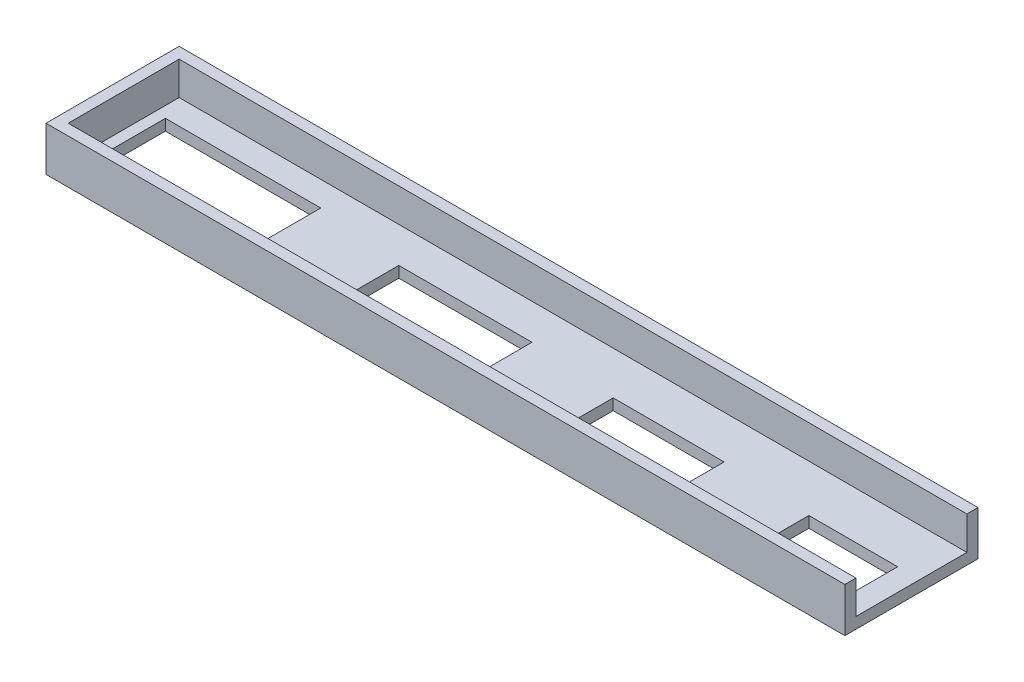
ISO-10303-21;
HEADER;
FILE_DESCRIPTION(('STEP AP214'),'2;1');
FILE_NAME('part.step','',(''),(''),'','','');
FILE_SCHEMA(('AUTOMOTIVE_DESIGN { 1 0 10303 214 1 1 1 1 }'));
ENDSEC;
DATA;
#1=APPLICATION_CONTEXT('core data for automotive mechanical design processes');
#2=APPLICATION_PROTOCOL_DEFINITION('international standard','automotive_design',2000,#1);
#3=PRODUCT_CONTEXT('',#1,'mechanical');
#4=PRODUCT('Part','Part','',(#3));
#5=PRODUCT_RELATED_PRODUCT_CATEGORY('part','',(#4));
#6=PRODUCT_DEFINITION_FORMATION('','',#4);
#7=PRODUCT_DEFINITION_CONTEXT('part definition',#1,'design');
#8=PRODUCT_DEFINITION('design','',#6,#7);
#9=PRODUCT_DEFINITION_SHAPE('','',#8);
#10=(LENGTH_UNIT() NAMED_UNIT(*) SI_UNIT(.MILLI.,.METRE.));
#11=(NAMED_UNIT(*) PLANE_ANGLE_UNIT() SI_UNIT($,.RADIAN.));
#12=(NAMED_UNIT(*) SI_UNIT($,.STERADIAN.) SOLID_ANGLE_UNIT());
#13=UNCERTAINTY_MEASURE_WITH_UNIT(LENGTH_MEASURE(1.E-05),#10,'distance_accuracy_value','');
#14=(GEOMETRIC_REPRESENTATION_CONTEXT(3) GLOBAL_UNCERTAINTY_ASSIGNED_CONTEXT((#13)) GLOBAL_UNIT_ASSIGNED_CONTEXT((#10,
#11,#12)) REPRESENTATION_CONTEXT('',''));
#15=CARTESIAN_POINT('',(0.,0.,0.));
#16=DIRECTION('',(0.,0.,1.));
#17=DIRECTION('',(1.,0.,0.));
#18=AXIS2_PLACEMENT_3D('',#15,#16,#17);
#19=CARTESIAN_POINT('',(0.,0.,0.));
#20=DIRECTION('',(0.,-1.,0.));
#21=DIRECTION('',(0.,0.,-1.));
#22=AXIS2_PLACEMENT_3D('',#19,#20,#21);
#23=PLANE('',#22);
#24=DIRECTION('',(0.,0.,-1.));
#25=VECTOR('',#24,1.);
#26=CARTESIAN_POINT('',(228.6,0.,0.));
#27=LINE('',#26,#25);
#28=CARTESIAN_POINT('',(228.6,0.,0.));
#29=VERTEX_POINT('',#28);
#30=CARTESIAN_POINT('',(228.6,0.,-3.175));
#31=VERTEX_POINT('',#30);
#32=EDGE_CURVE('E454',#29,#31,#27,.T.);
#33=ORIENTED_EDGE('',*,*,#32,.T.);
#34=DIRECTION('',(1.,0.,0.));
#35=VECTOR('',#34,1.);
#36=CARTESIAN_POINT('',(0.,0.,-3.175));
#37=LINE('',#36,#35);
#38=CARTESIAN_POINT('',(3.175,0.,-3.175));
#39=VERTEX_POINT('',#38);
#40=EDGE_CURVE('E423',#39,#31,#37,.T.);
#41=ORIENTED_EDGE('',*,*,#40,.F.);
#42=DIRECTION('',(0.,0.,1.));
#43=VECTOR('',#42,1.);
#44=CARTESIAN_POINT('',(3.175,0.,0.));
#45=LINE('',#44,#43);
#46=CARTESIAN_POINT('',(3.175,0.,-34.925));
#47=VERTEX_POINT('',#46);
#48=EDGE_CURVE('E397',#47,#39,#45,.T.);
#49=ORIENTED_EDGE('',*,*,#48,.F.);
#50=DIRECTION('',(-1.,0.,0.));
#51=VECTOR('',#50,1.);
#52=CARTESIAN_POINT('',(0.,0.,-34.925));
#53=LINE('',#52,#51);
#54=CARTESIAN_POINT('',(228.6,0.,-34.925));
#55=VERTEX_POINT('',#54);
#56=EDGE_CURVE('E411',#55,#47,#53,.T.);
#57=ORIENTED_EDGE('',*,*,#56,.F.);
#58=CARTESIAN_POINT('',(228.6,0.,-38.1));
#59=VERTEX_POINT('',#58);
#60=EDGE_CURVE('E453',#55,#59,#27,.T.);
#61=ORIENTED_EDGE('',*,*,#60,.T.);
#62=DIRECTION('',(-1.,0.,0.));
#63=VECTOR('',#62,1.);
#64=CARTESIAN_POINT('',(0.,0.,-38.1));
#65=LINE('',#64,#63);
#66=CARTESIAN_POINT('',(0.,0.,-38.1));
#67=VERTEX_POINT('',#66);
#68=EDGE_CURVE('E434',#59,#67,#65,.T.);
#69=ORIENTED_EDGE('',*,*,#68,.T.);
#70=DIRECTION('',(0.,0.,1.));
#71=VECTOR('',#70,1.);
#72=CARTESIAN_POINT('',(0.,0.,0.));
#73=LINE('',#72,#71);
#74=CARTESIAN_POINT('',(0.,0.,0.));
#75=VERTEX_POINT('',#74);
#76=EDGE_CURVE('E404',#67,#75,#73,.T.);
#77=ORIENTED_EDGE('',*,*,#76,.T.);
#78=DIRECTION('',(1.,0.,0.));
#79=VECTOR('',#78,1.);
#80=CARTESIAN_POINT('',(0.,0.,0.));
#81=LINE('',#80,#79);
#82=EDGE_CURVE('E449',#75,#29,#81,.T.);
#83=ORIENTED_EDGE('',*,*,#82,.T.);
#84=EDGE_LOOP('',(#33,#41,#49,#57,#61,#69,#77,#83));
#85=FACE_BOUND('',#84,.T.);
#86=ADVANCED_FACE('F43',(#85),#23,.F.);
#87=CARTESIAN_POINT('',(0.,-12.7,0.));
#88=DIRECTION('',(-1.,0.,0.));
#89=DIRECTION('',(0.,0.,1.));
#90=AXIS2_PLACEMENT_3D('',#87,#88,#89);
#91=PLANE('',#90);
#92=ORIENTED_EDGE('',*,*,#76,.F.);
#93=DIRECTION('',(0.,1.,0.));
#94=VECTOR('',#93,1.);
#95=CARTESIAN_POINT('',(0.,-12.7,-38.1));
#96=LINE('',#95,#94);
#97=CARTESIAN_POINT('',(0.,-12.7,-38.1));
#98=VERTEX_POINT('',#97);
#99=EDGE_CURVE('E11',#98,#67,#96,.T.);
#100=ORIENTED_EDGE('',*,*,#99,.F.);
#101=DIRECTION('',(0.,0.,1.));
#102=VECTOR('',#101,1.);
#103=CARTESIAN_POINT('',(0.,-12.7,0.));
#104=LINE('',#103,#102);
#105=CARTESIAN_POINT('',(0.,-12.7,0.));
#106=VERTEX_POINT('',#105);
#107=EDGE_CURVE('E429',#98,#106,#104,.T.);
#108=ORIENTED_EDGE('',*,*,#107,.T.);
#109=DIRECTION('',(0.,1.,0.));
#110=VECTOR('',#109,1.);
#111=CARTESIAN_POINT('',(0.,-12.7,0.));
#112=LINE('',#111,#110);
#113=EDGE_CURVE('E47',#106,#75,#112,.T.);
#114=ORIENTED_EDGE('',*,*,#113,.T.);
#115=EDGE_LOOP('',(#92,#100,#108,#114));
#116=FACE_BOUND('',#115,.T.);
#117=ADVANCED_FACE('F45',(#116),#91,.T.);
#118=CARTESIAN_POINT('',(0.,-12.7,-38.1));
#119=DIRECTION('',(0.,0.,-1.));
#120=DIRECTION('',(-1.,0.,0.));
#121=AXIS2_PLACEMENT_3D('',#118,#119,#120);
#122=PLANE('',#121);
#123=ORIENTED_EDGE('',*,*,#68,.F.);
#124=DIRECTION('',(0.,1.,0.));
#125=VECTOR('',#124,1.);
#126=CARTESIAN_POINT('',(228.6,-12.7,-38.1));
#127=LINE('',#126,#125);
#128=CARTESIAN_POINT('',(228.6,-12.7,-38.1));
#129=VERTEX_POINT('',#128);
#130=EDGE_CURVE('E53',#129,#59,#127,.T.);
#131=ORIENTED_EDGE('',*,*,#130,.F.);
#132=DIRECTION('',(-1.,0.,0.));
#133=VECTOR('',#132,1.);
#134=CARTESIAN_POINT('',(0.,-12.7,-38.1));
#135=LINE('',#134,#133);
#136=EDGE_CURVE('E442',#129,#98,#135,.T.);
#137=ORIENTED_EDGE('',*,*,#136,.T.);
#138=ORIENTED_EDGE('',*,*,#99,.T.);
#139=EDGE_LOOP('',(#123,#131,#137,#138));
#140=FACE_BOUND('',#139,.T.);
#141=ADVANCED_FACE('F478',(#140),#122,.T.);
#142=CARTESIAN_POINT('',(228.6,-12.7,0.));
#143=DIRECTION('',(1.,0.,0.));
#144=DIRECTION('',(0.,0.,-1.));
#145=AXIS2_PLACEMENT_3D('',#142,#143,#144);
#146=PLANE('',#145);
#147=DIRECTION('',(0.,1.,0.));
#148=VECTOR('',#147,1.);
#149=CARTESIAN_POINT('',(228.6,-41.4333550970588,-3.175));
#150=LINE('',#149,#148);
#151=CARTESIAN_POINT('',(228.6,-9.525,-3.175));
#152=VERTEX_POINT('',#151);
#153=EDGE_CURVE('E254',#152,#31,#150,.T.);
#154=ORIENTED_EDGE('',*,*,#153,.T.);
#155=ORIENTED_EDGE('',*,*,#32,.F.);
#156=DIRECTION('',(0.,1.,0.));
#157=VECTOR('',#156,1.);
#158=CARTESIAN_POINT('',(228.6,-12.7,0.));
#159=LINE('',#158,#157);
#160=CARTESIAN_POINT('',(228.6,-12.7,0.));
#161=VERTEX_POINT('',#160);
#162=EDGE_CURVE('E463',#161,#29,#159,.T.);
#163=ORIENTED_EDGE('',*,*,#162,.F.);
#164=DIRECTION('',(0.,0.,-1.));
#165=VECTOR('',#164,1.);
#166=CARTESIAN_POINT('',(228.6,-12.7,0.));
#167=LINE('',#166,#165);
#168=EDGE_CURVE('E438',#161,#129,#167,.T.);
#169=ORIENTED_EDGE('',*,*,#168,.T.);
#170=ORIENTED_EDGE('',*,*,#130,.T.);
#171=ORIENTED_EDGE('',*,*,#60,.F.);
#172=DIRECTION('',(0.,1.,0.));
#173=VECTOR('',#172,1.);
#174=CARTESIAN_POINT('',(228.6,-41.4333550970588,-34.925));
#175=LINE('',#174,#173);
#176=CARTESIAN_POINT('',(228.6,-9.525,-34.925));
#177=VERTEX_POINT('',#176);
#178=EDGE_CURVE('E393',#177,#55,#175,.T.);
#179=ORIENTED_EDGE('',*,*,#178,.F.);
#180=DIRECTION('',(0.,0.,-1.));
#181=VECTOR('',#180,1.);
#182=CARTESIAN_POINT('',(228.6,-9.525,-34.925));
#183=LINE('',#182,#181);
#184=EDGE_CURVE('E389',#152,#177,#183,.T.);
#185=ORIENTED_EDGE('',*,*,#184,.F.);
#186=EDGE_LOOP('',(#154,#155,#163,#169,#170,#171,#179,#185));
#187=FACE_BOUND('',#186,.T.);
#188=ADVANCED_FACE('F483',(#187),#146,.T.);
#189=CARTESIAN_POINT('',(0.,-12.7,0.));
#190=DIRECTION('',(0.,0.,1.));
#191=DIRECTION('',(1.,0.,0.));
#192=AXIS2_PLACEMENT_3D('',#189,#190,#191);
#193=PLANE('',#192);
#194=ORIENTED_EDGE('',*,*,#82,.F.);
#195=ORIENTED_EDGE('',*,*,#113,.F.);
#196=DIRECTION('',(1.,0.,0.));
#197=VECTOR('',#196,1.);
#198=CARTESIAN_POINT('',(0.,-12.7,0.));
#199=LINE('',#198,#197);
#200=EDGE_CURVE('E433',#106,#161,#199,.T.);
#201=ORIENTED_EDGE('',*,*,#200,.T.);
#202=ORIENTED_EDGE('',*,*,#162,.T.);
#203=EDGE_LOOP('',(#194,#195,#201,#202));
#204=FACE_BOUND('',#203,.T.);
#205=ADVANCED_FACE('F473',(#204),#193,.T.);
#206=CARTESIAN_POINT('',(0.,-12.7,0.));
#207=DIRECTION('',(0.,-1.,0.));
#208=DIRECTION('',(0.,0.,-1.));
#209=AXIS2_PLACEMENT_3D('',#206,#207,#208);
#210=PLANE('',#209);
#211=DIRECTION('',(0.,0.,-1.));
#212=VECTOR('',#211,1.);
#213=CARTESIAN_POINT('',(222.25,-12.7,-5.08));
#214=LINE('',#213,#212);
#215=CARTESIAN_POINT('',(222.25,-12.7,-5.08));
#216=VERTEX_POINT('',#215);
#217=CARTESIAN_POINT('',(222.25,-12.7,-21.463));
#218=VERTEX_POINT('',#217);
#219=EDGE_CURVE('E210',#216,#218,#214,.T.);
#220=ORIENTED_EDGE('',*,*,#219,.T.);
#221=DIRECTION('',(-1.,0.,0.));
#222=VECTOR('',#221,1.);
#223=CARTESIAN_POINT('',(222.25,-12.7,-21.463));
#224=LINE('',#223,#222);
#225=CARTESIAN_POINT('',(196.85,-12.7,-21.463));
#226=VERTEX_POINT('',#225);
#227=EDGE_CURVE('E222',#218,#226,#224,.T.);
#228=ORIENTED_EDGE('',*,*,#227,.T.);
#229=DIRECTION('',(0.,0.,1.));
#230=VECTOR('',#229,1.);
#231=CARTESIAN_POINT('',(196.85,-12.7,-5.08));
#232=LINE('',#231,#230);
#233=CARTESIAN_POINT('',(196.85,-12.7,-5.08));
#234=VERTEX_POINT('',#233);
#235=EDGE_CURVE('E61',#226,#234,#232,.T.);
#236=ORIENTED_EDGE('',*,*,#235,.T.);
#237=DIRECTION('',(1.,0.,0.));
#238=VECTOR('',#237,1.);
#239=CARTESIAN_POINT('',(222.25,-12.7,-5.08));
#240=LINE('',#239,#238);
#241=EDGE_CURVE('E219',#234,#216,#240,.T.);
#242=ORIENTED_EDGE('',*,*,#241,.T.);
#243=EDGE_LOOP('',(#220,#228,#236,#242));
#244=FACE_BOUND('',#243,.T.);
#245=DIRECTION('',(0.,0.,1.));
#246=VECTOR('',#245,1.);
#247=CARTESIAN_POINT('',(139.7,-12.7,-22.606));
#248=LINE('',#247,#246);
#249=CARTESIAN_POINT('',(139.7,-12.7,-22.606));
#250=VERTEX_POINT('',#249);
#251=CARTESIAN_POINT('',(139.7,-12.7,-5.08));
#252=VERTEX_POINT('',#251);
#253=EDGE_CURVE('E280',#250,#252,#248,.T.);
#254=ORIENTED_EDGE('',*,*,#253,.T.);
#255=DIRECTION('',(1.,0.,0.));
#256=VECTOR('',#255,1.);
#257=CARTESIAN_POINT('',(139.7,-12.7,-5.08));
#258=LINE('',#257,#256);
#259=CARTESIAN_POINT('',(171.45,-12.7,-5.08));
#260=VERTEX_POINT('',#259);
#261=EDGE_CURVE('E295',#252,#260,#258,.T.);
#262=ORIENTED_EDGE('',*,*,#261,.T.);
#263=DIRECTION('',(0.,0.,-1.));
#264=VECTOR('',#263,1.);
#265=CARTESIAN_POINT('',(171.45,-12.7,-22.606));
#266=LINE('',#265,#264);
#267=CARTESIAN_POINT('',(171.45,-12.7,-22.606));
#268=VERTEX_POINT('',#267);
#269=EDGE_CURVE('E69',#260,#268,#266,.T.);
#270=ORIENTED_EDGE('',*,*,#269,.T.);
#271=DIRECTION('',(-1.,0.,0.));
#272=VECTOR('',#271,1.);
#273=CARTESIAN_POINT('',(139.7,-12.7,-22.606));
#274=LINE('',#273,#272);
#275=EDGE_CURVE('E264',#268,#250,#274,.T.);
#276=ORIENTED_EDGE('',*,*,#275,.T.);
#277=EDGE_LOOP('',(#254,#262,#270,#276));
#278=FACE_BOUND('',#277,.T.);
#279=DIRECTION('',(0.,0.,1.));
#280=VECTOR('',#279,1.);
#281=CARTESIAN_POINT('',(76.2,-12.7,-24.765));
#282=LINE('',#281,#280);
#283=CARTESIAN_POINT('',(76.2,-12.7,-24.765));
#284=VERTEX_POINT('',#283);
#285=CARTESIAN_POINT('',(76.2,-12.7,-5.08));
#286=VERTEX_POINT('',#285);
#287=EDGE_CURVE('E322',#284,#286,#282,.T.);
#288=ORIENTED_EDGE('',*,*,#287,.T.);
#289=DIRECTION('',(1.,0.,0.));
#290=VECTOR('',#289,1.);
#291=CARTESIAN_POINT('',(76.2,-12.7,-5.08));
#292=LINE('',#291,#290);
#293=CARTESIAN_POINT('',(114.3,-12.7,-5.08));
#294=VERTEX_POINT('',#293);
#295=EDGE_CURVE('E339',#286,#294,#292,.T.);
#296=ORIENTED_EDGE('',*,*,#295,.T.);
#297=DIRECTION('',(0.,0.,-1.));
#298=VECTOR('',#297,1.);
#299=CARTESIAN_POINT('',(114.3,-12.7,-24.765));
#300=LINE('',#299,#298);
#301=CARTESIAN_POINT('',(114.3,-12.7,-24.765));
#302=VERTEX_POINT('',#301);
#303=EDGE_CURVE('E335',#294,#302,#300,.T.);
#304=ORIENTED_EDGE('',*,*,#303,.T.);
#305=DIRECTION('',(-1.,0.,0.));
#306=VECTOR('',#305,1.);
#307=CARTESIAN_POINT('',(76.2,-12.7,-24.765));
#308=LINE('',#307,#306);
#309=EDGE_CURVE('E306',#302,#284,#308,.T.);
#310=ORIENTED_EDGE('',*,*,#309,.T.);
#311=EDGE_LOOP('',(#288,#296,#304,#310));
#312=FACE_BOUND('',#311,.T.);
#313=DIRECTION('',(0.,0.,1.));
#314=VECTOR('',#313,1.);
#315=CARTESIAN_POINT('',(6.34999999999999,-12.7,-27.813));
#316=LINE('',#315,#314);
#317=CARTESIAN_POINT('',(6.34999999999999,-12.7,-27.813));
#318=VERTEX_POINT('',#317);
#319=CARTESIAN_POINT('',(6.34999999999999,-12.7,-5.08));
#320=VERTEX_POINT('',#319);
#321=EDGE_CURVE('E365',#318,#320,#316,.T.);
#322=ORIENTED_EDGE('',*,*,#321,.T.);
#323=DIRECTION('',(1.,0.,0.));
#324=VECTOR('',#323,1.);
#325=CARTESIAN_POINT('',(6.34999999999999,-12.7,-5.08));
#326=LINE('',#325,#324);
#327=CARTESIAN_POINT('',(50.8,-12.7,-5.08));
#328=VERTEX_POINT('',#327);
#329=EDGE_CURVE('E382',#320,#328,#326,.T.);
#330=ORIENTED_EDGE('',*,*,#329,.T.);
#331=DIRECTION('',(0.,0.,-1.));
#332=VECTOR('',#331,1.);
#333=CARTESIAN_POINT('',(50.8,-12.7,-27.813));
#334=LINE('',#333,#332);
#335=CARTESIAN_POINT('',(50.8,-12.7,-27.813));
#336=VERTEX_POINT('',#335);
#337=EDGE_CURVE('E378',#328,#336,#334,.T.);
#338=ORIENTED_EDGE('',*,*,#337,.T.);
#339=DIRECTION('',(-1.,0.,0.));
#340=VECTOR('',#339,1.);
#341=CARTESIAN_POINT('',(6.34999999999999,-12.7,-27.813));
#342=LINE('',#341,#340);
#343=EDGE_CURVE('E350',#336,#318,#342,.T.);
#344=ORIENTED_EDGE('',*,*,#343,.T.);
#345=EDGE_LOOP('',(#322,#330,#338,#344));
#346=FACE_BOUND('',#345,.T.);
#347=ORIENTED_EDGE('',*,*,#107,.F.);
#348=ORIENTED_EDGE('',*,*,#136,.F.);
#349=ORIENTED_EDGE('',*,*,#168,.F.);
#350=ORIENTED_EDGE('',*,*,#200,.F.);
#351=EDGE_LOOP('',(#347,#348,#349,#350));
#352=FACE_BOUND('',#351,.T.);
#353=ADVANCED_FACE('F227',(#244,#278,#312,#346,#352),#210,.T.);
#354=CARTESIAN_POINT('',(3.175,-12.7,0.));
#355=DIRECTION('',(-1.,0.,0.));
#356=DIRECTION('',(0.,0.,1.));
#357=AXIS2_PLACEMENT_3D('',#354,#355,#356);
#358=PLANE('',#357);
#359=ORIENTED_EDGE('',*,*,#48,.T.);
#360=DIRECTION('',(0.,1.,0.));
#361=VECTOR('',#360,1.);
#362=CARTESIAN_POINT('',(3.175,-12.7,-3.175));
#363=LINE('',#362,#361);
#364=CARTESIAN_POINT('',(3.175,-9.525,-3.175));
#365=VERTEX_POINT('',#364);
#366=EDGE_CURVE('E405',#365,#39,#363,.T.);
#367=ORIENTED_EDGE('',*,*,#366,.F.);
#368=DIRECTION('',(0.,0.,1.));
#369=VECTOR('',#368,1.);
#370=CARTESIAN_POINT('',(3.175,-9.525,0.));
#371=LINE('',#370,#369);
#372=CARTESIAN_POINT('',(3.175,-9.525,-34.925));
#373=VERTEX_POINT('',#372);
#374=EDGE_CURVE('E406',#373,#365,#371,.T.);
#375=ORIENTED_EDGE('',*,*,#374,.F.);
#376=DIRECTION('',(0.,1.,0.));
#377=VECTOR('',#376,1.);
#378=CARTESIAN_POINT('',(3.175,-12.7,-34.925));
#379=LINE('',#378,#377);
#380=EDGE_CURVE('E401',#373,#47,#379,.T.);
#381=ORIENTED_EDGE('',*,*,#380,.T.);
#382=EDGE_LOOP('',(#359,#367,#375,#381));
#383=FACE_BOUND('',#382,.T.);
#384=ADVANCED_FACE('F493',(#383),#358,.F.);
#385=CARTESIAN_POINT('',(0.,-12.7,-34.925));
#386=DIRECTION('',(0.,0.,-1.));
#387=DIRECTION('',(-1.,0.,0.));
#388=AXIS2_PLACEMENT_3D('',#385,#386,#387);
#389=PLANE('',#388);
#390=ORIENTED_EDGE('',*,*,#56,.T.);
#391=ORIENTED_EDGE('',*,*,#380,.F.);
#392=DIRECTION('',(-1.,0.,0.));
#393=VECTOR('',#392,1.);
#394=CARTESIAN_POINT('',(0.,-9.525,-34.925));
#395=LINE('',#394,#393);
#396=EDGE_CURVE('E414',#177,#373,#395,.T.);
#397=ORIENTED_EDGE('',*,*,#396,.F.);
#398=ORIENTED_EDGE('',*,*,#178,.T.);
#399=EDGE_LOOP('',(#390,#391,#397,#398));
#400=FACE_BOUND('',#399,.T.);
#401=ADVANCED_FACE('F495',(#400),#389,.F.);
#402=CARTESIAN_POINT('',(0.,-12.7,-3.175));
#403=DIRECTION('',(0.,0.,1.));
#404=DIRECTION('',(1.,0.,0.));
#405=AXIS2_PLACEMENT_3D('',#402,#403,#404);
#406=PLANE('',#405);
#407=ORIENTED_EDGE('',*,*,#40,.T.);
#408=ORIENTED_EDGE('',*,*,#153,.F.);
#409=DIRECTION('',(1.,0.,0.));
#410=VECTOR('',#409,1.);
#411=CARTESIAN_POINT('',(0.,-9.525,-3.175));
#412=LINE('',#411,#410);
#413=EDGE_CURVE('E410',#365,#152,#412,.T.);
#414=ORIENTED_EDGE('',*,*,#413,.F.);
#415=ORIENTED_EDGE('',*,*,#366,.T.);
#416=EDGE_LOOP('',(#407,#408,#414,#415));
#417=FACE_BOUND('',#416,.T.);
#418=ADVANCED_FACE('F489',(#417),#406,.F.);
#419=CARTESIAN_POINT('',(0.,-9.525,0.));
#420=DIRECTION('',(0.,-1.,0.));
#421=DIRECTION('',(0.,0.,-1.));
#422=AXIS2_PLACEMENT_3D('',#419,#420,#421);
#423=PLANE('',#422);
#424=DIRECTION('',(-1.,0.,0.));
#425=VECTOR('',#424,1.);
#426=CARTESIAN_POINT('',(222.25,-9.525,-21.463));
#427=LINE('',#426,#425);
#428=CARTESIAN_POINT('',(222.25,-9.525,-21.463));
#429=VERTEX_POINT('',#428);
#430=CARTESIAN_POINT('',(196.85,-9.525,-21.463));
#431=VERTEX_POINT('',#430);
#432=EDGE_CURVE('E244',#429,#431,#427,.T.);
#433=ORIENTED_EDGE('',*,*,#432,.F.);
#434=DIRECTION('',(0.,0.,-1.));
#435=VECTOR('',#434,1.);
#436=CARTESIAN_POINT('',(222.25,-9.525,-5.08));
#437=LINE('',#436,#435);
#438=CARTESIAN_POINT('',(222.25,-9.525,-5.08));
#439=VERTEX_POINT('',#438);
#440=EDGE_CURVE('E213',#439,#429,#437,.T.);
#441=ORIENTED_EDGE('',*,*,#440,.F.);
#442=DIRECTION('',(1.,0.,0.));
#443=VECTOR('',#442,1.);
#444=CARTESIAN_POINT('',(222.25,-9.525,-5.08));
#445=LINE('',#444,#443);
#446=CARTESIAN_POINT('',(196.85,-9.525,-5.08));
#447=VERTEX_POINT('',#446);
#448=EDGE_CURVE('E231',#447,#439,#445,.T.);
#449=ORIENTED_EDGE('',*,*,#448,.F.);
#450=DIRECTION('',(0.,0.,1.));
#451=VECTOR('',#450,1.);
#452=CARTESIAN_POINT('',(196.85,-9.525,-5.08));
#453=LINE('',#452,#451);
#454=EDGE_CURVE('E235',#431,#447,#453,.T.);
#455=ORIENTED_EDGE('',*,*,#454,.F.);
#456=EDGE_LOOP('',(#433,#441,#449,#455));
#457=FACE_BOUND('',#456,.T.);
#458=DIRECTION('',(1.,0.,0.));
#459=VECTOR('',#458,1.);
#460=CARTESIAN_POINT('',(139.7,-9.525,-5.08));
#461=LINE('',#460,#459);
#462=CARTESIAN_POINT('',(139.7,-9.525,-5.08));
#463=VERTEX_POINT('',#462);
#464=CARTESIAN_POINT('',(171.45,-9.525,-5.08));
#465=VERTEX_POINT('',#464);
#466=EDGE_CURVE('E284',#463,#465,#461,.T.);
#467=ORIENTED_EDGE('',*,*,#466,.F.);
#468=DIRECTION('',(0.,0.,1.));
#469=VECTOR('',#468,1.);
#470=CARTESIAN_POINT('',(139.7,-9.525,-22.606));
#471=LINE('',#470,#469);
#472=CARTESIAN_POINT('',(139.7,-9.525,-22.606));
#473=VERTEX_POINT('',#472);
#474=EDGE_CURVE('E245',#473,#463,#471,.T.);
#475=ORIENTED_EDGE('',*,*,#474,.F.);
#476=DIRECTION('',(-1.,0.,0.));
#477=VECTOR('',#476,1.);
#478=CARTESIAN_POINT('',(139.7,-9.525,-22.606));
#479=LINE('',#478,#477);
#480=CARTESIAN_POINT('',(171.45,-9.525,-22.606));
#481=VERTEX_POINT('',#480);
#482=EDGE_CURVE('E275',#481,#473,#479,.T.);
#483=ORIENTED_EDGE('',*,*,#482,.F.);
#484=DIRECTION('',(0.,0.,-1.));
#485=VECTOR('',#484,1.);
#486=CARTESIAN_POINT('',(171.45,-9.525,-22.606));
#487=LINE('',#486,#485);
#488=EDGE_CURVE('E279',#465,#481,#487,.T.);
#489=ORIENTED_EDGE('',*,*,#488,.F.);
#490=EDGE_LOOP('',(#467,#475,#483,#489));
#491=FACE_BOUND('',#490,.T.);
#492=DIRECTION('',(1.,0.,0.));
#493=VECTOR('',#492,1.);
#494=CARTESIAN_POINT('',(76.2,-9.525,-5.08));
#495=LINE('',#494,#493);
#496=CARTESIAN_POINT('',(76.2,-9.525,-5.08));
#497=VERTEX_POINT('',#496);
#498=CARTESIAN_POINT('',(114.3,-9.525,-5.08));
#499=VERTEX_POINT('',#498);
#500=EDGE_CURVE('E326',#497,#499,#495,.T.);
#501=ORIENTED_EDGE('',*,*,#500,.F.);
#502=DIRECTION('',(0.,0.,1.));
#503=VECTOR('',#502,1.);
#504=CARTESIAN_POINT('',(76.2,-9.525,-24.765));
#505=LINE('',#504,#503);
#506=CARTESIAN_POINT('',(76.2,-9.525,-24.765));
#507=VERTEX_POINT('',#506);
#508=EDGE_CURVE('E274',#507,#497,#505,.T.);
#509=ORIENTED_EDGE('',*,*,#508,.F.);
#510=DIRECTION('',(-1.,0.,0.));
#511=VECTOR('',#510,1.);
#512=CARTESIAN_POINT('',(76.2,-9.525,-24.765));
#513=LINE('',#512,#511);
#514=CARTESIAN_POINT('',(114.3,-9.525,-24.765));
#515=VERTEX_POINT('',#514);
#516=EDGE_CURVE('E317',#515,#507,#513,.T.);
#517=ORIENTED_EDGE('',*,*,#516,.F.);
#518=DIRECTION('',(0.,0.,-1.));
#519=VECTOR('',#518,1.);
#520=CARTESIAN_POINT('',(114.3,-9.525,-24.765));
#521=LINE('',#520,#519);
#522=EDGE_CURVE('E321',#499,#515,#521,.T.);
#523=ORIENTED_EDGE('',*,*,#522,.F.);
#524=EDGE_LOOP('',(#501,#509,#517,#523));
#525=FACE_BOUND('',#524,.T.);
#526=DIRECTION('',(1.,0.,0.));
#527=VECTOR('',#526,1.);
#528=CARTESIAN_POINT('',(6.34999999999999,-9.525,-5.08));
#529=LINE('',#528,#527);
#530=CARTESIAN_POINT('',(6.34999999999999,-9.525,-5.08));
#531=VERTEX_POINT('',#530);
#532=CARTESIAN_POINT('',(50.8,-9.525,-5.08));
#533=VERTEX_POINT('',#532);
#534=EDGE_CURVE('E369',#531,#533,#529,.T.);
#535=ORIENTED_EDGE('',*,*,#534,.F.);
#536=DIRECTION('',(0.,0.,1.));
#537=VECTOR('',#536,1.);
#538=CARTESIAN_POINT('',(6.34999999999999,-9.525,-27.813));
#539=LINE('',#538,#537);
#540=CARTESIAN_POINT('',(6.34999999999999,-9.525,-27.813));
#541=VERTEX_POINT('',#540);
#542=EDGE_CURVE('E316',#541,#531,#539,.T.);
#543=ORIENTED_EDGE('',*,*,#542,.F.);
#544=DIRECTION('',(-1.,0.,0.));
#545=VECTOR('',#544,1.);
#546=CARTESIAN_POINT('',(6.34999999999999,-9.525,-27.813));
#547=LINE('',#546,#545);
#548=CARTESIAN_POINT('',(50.8,-9.525,-27.813));
#549=VERTEX_POINT('',#548);
#550=EDGE_CURVE('E360',#549,#541,#547,.T.);
#551=ORIENTED_EDGE('',*,*,#550,.F.);
#552=DIRECTION('',(0.,0.,-1.));
#553=VECTOR('',#552,1.);
#554=CARTESIAN_POINT('',(50.8,-9.525,-27.813));
#555=LINE('',#554,#553);
#556=EDGE_CURVE('E364',#533,#549,#555,.T.);
#557=ORIENTED_EDGE('',*,*,#556,.F.);
#558=EDGE_LOOP('',(#535,#543,#551,#557));
#559=FACE_BOUND('',#558,.T.);
#560=ORIENTED_EDGE('',*,*,#374,.T.);
#561=ORIENTED_EDGE('',*,*,#413,.T.);
#562=ORIENTED_EDGE('',*,*,#184,.T.);
#563=ORIENTED_EDGE('',*,*,#396,.T.);
#564=EDGE_LOOP('',(#560,#561,#562,#563));
#565=FACE_BOUND('',#564,.T.);
#566=ADVANCED_FACE('F499',(#457,#491,#525,#559,#565),#423,.F.);
#567=CARTESIAN_POINT('',(6.34999999999999,-12.7,-27.813));
#568=DIRECTION('',(-1.,0.,0.));
#569=DIRECTION('',(0.,0.,1.));
#570=AXIS2_PLACEMENT_3D('',#567,#568,#569);
#571=PLANE('',#570);
#572=ORIENTED_EDGE('',*,*,#542,.T.);
#573=DIRECTION('',(0.,1.,0.));
#574=VECTOR('',#573,1.);
#575=CARTESIAN_POINT('',(6.34999999999999,-12.7,-5.08));
#576=LINE('',#575,#574);
#577=EDGE_CURVE('E346',#320,#531,#576,.T.);
#578=ORIENTED_EDGE('',*,*,#577,.F.);
#579=ORIENTED_EDGE('',*,*,#321,.F.);
#580=DIRECTION('',(0.,1.,0.));
#581=VECTOR('',#580,1.);
#582=CARTESIAN_POINT('',(6.34999999999999,-12.7,-27.813));
#583=LINE('',#582,#581);
#584=EDGE_CURVE('E357',#318,#541,#583,.T.);
#585=ORIENTED_EDGE('',*,*,#584,.T.);
#586=EDGE_LOOP('',(#572,#578,#579,#585));
#587=FACE_BOUND('',#586,.T.);
#588=ADVANCED_FACE('F501',(#587),#571,.F.);
#589=CARTESIAN_POINT('',(6.34999999999999,-12.7,-27.813));
#590=DIRECTION('',(0.,0.,-1.));
#591=DIRECTION('',(-1.,0.,0.));
#592=AXIS2_PLACEMENT_3D('',#589,#590,#591);
#593=PLANE('',#592);
#594=ORIENTED_EDGE('',*,*,#550,.T.);
#595=ORIENTED_EDGE('',*,*,#584,.F.);
#596=ORIENTED_EDGE('',*,*,#343,.F.);
#597=DIRECTION('',(0.,1.,0.));
#598=VECTOR('',#597,1.);
#599=CARTESIAN_POINT('',(50.8,-12.7,-27.813));
#600=LINE('',#599,#598);
#601=EDGE_CURVE('E354',#336,#549,#600,.T.);
#602=ORIENTED_EDGE('',*,*,#601,.T.);
#603=EDGE_LOOP('',(#594,#595,#596,#602));
#604=FACE_BOUND('',#603,.T.);
#605=ADVANCED_FACE('F508',(#604),#593,.F.);
#606=CARTESIAN_POINT('',(50.8,-12.7,-27.813));
#607=DIRECTION('',(1.,0.,0.));
#608=DIRECTION('',(0.,0.,-1.));
#609=AXIS2_PLACEMENT_3D('',#606,#607,#608);
#610=PLANE('',#609);
#611=ORIENTED_EDGE('',*,*,#556,.T.);
#612=ORIENTED_EDGE('',*,*,#601,.F.);
#613=ORIENTED_EDGE('',*,*,#337,.F.);
#614=DIRECTION('',(0.,1.,0.));
#615=VECTOR('',#614,1.);
#616=CARTESIAN_POINT('',(50.8,-12.7,-5.08));
#617=LINE('',#616,#615);
#618=EDGE_CURVE('E351',#328,#533,#617,.T.);
#619=ORIENTED_EDGE('',*,*,#618,.T.);
#620=EDGE_LOOP('',(#611,#612,#613,#619));
#621=FACE_BOUND('',#620,.T.);
#622=ADVANCED_FACE('F538',(#621),#610,.F.);
#623=CARTESIAN_POINT('',(6.34999999999999,-12.7,-5.08));
#624=DIRECTION('',(0.,0.,1.));
#625=DIRECTION('',(1.,0.,0.));
#626=AXIS2_PLACEMENT_3D('',#623,#624,#625);
#627=PLANE('',#626);
#628=ORIENTED_EDGE('',*,*,#534,.T.);
#629=ORIENTED_EDGE('',*,*,#618,.F.);
#630=ORIENTED_EDGE('',*,*,#329,.F.);
#631=ORIENTED_EDGE('',*,*,#577,.T.);
#632=EDGE_LOOP('',(#628,#629,#630,#631));
#633=FACE_BOUND('',#632,.T.);
#634=ADVANCED_FACE('F542',(#633),#627,.F.);
#635=CARTESIAN_POINT('',(76.2,-12.7,-24.765));
#636=DIRECTION('',(-1.,0.,0.));
#637=DIRECTION('',(0.,0.,1.));
#638=AXIS2_PLACEMENT_3D('',#635,#636,#637);
#639=PLANE('',#638);
#640=ORIENTED_EDGE('',*,*,#508,.T.);
#641=DIRECTION('',(0.,1.,0.));
#642=VECTOR('',#641,1.);
#643=CARTESIAN_POINT('',(76.2,-12.7,-5.08));
#644=LINE('',#643,#642);
#645=EDGE_CURVE('E302',#286,#497,#644,.T.);
#646=ORIENTED_EDGE('',*,*,#645,.F.);
#647=ORIENTED_EDGE('',*,*,#287,.F.);
#648=DIRECTION('',(0.,1.,0.));
#649=VECTOR('',#648,1.);
#650=CARTESIAN_POINT('',(76.2,-12.7,-24.765));
#651=LINE('',#650,#649);
#652=EDGE_CURVE('E313',#284,#507,#651,.T.);
#653=ORIENTED_EDGE('',*,*,#652,.T.);
#654=EDGE_LOOP('',(#640,#646,#647,#653));
#655=FACE_BOUND('',#654,.T.);
#656=ADVANCED_FACE('F545',(#655),#639,.F.);
#657=CARTESIAN_POINT('',(76.2,-12.7,-24.765));
#658=DIRECTION('',(0.,0.,-1.));
#659=DIRECTION('',(-1.,0.,0.));
#660=AXIS2_PLACEMENT_3D('',#657,#658,#659);
#661=PLANE('',#660);
#662=ORIENTED_EDGE('',*,*,#516,.T.);
#663=ORIENTED_EDGE('',*,*,#652,.F.);
#664=ORIENTED_EDGE('',*,*,#309,.F.);
#665=DIRECTION('',(0.,1.,0.));
#666=VECTOR('',#665,1.);
#667=CARTESIAN_POINT('',(114.3,-12.7,-24.765));
#668=LINE('',#667,#666);
#669=EDGE_CURVE('E310',#302,#515,#668,.T.);
#670=ORIENTED_EDGE('',*,*,#669,.T.);
#671=EDGE_LOOP('',(#662,#663,#664,#670));
#672=FACE_BOUND('',#671,.T.);
#673=ADVANCED_FACE('F548',(#672),#661,.F.);
#674=CARTESIAN_POINT('',(114.3,-12.7,-24.765));
#675=DIRECTION('',(1.,0.,0.));
#676=DIRECTION('',(0.,0.,-1.));
#677=AXIS2_PLACEMENT_3D('',#674,#675,#676);
#678=PLANE('',#677);
#679=ORIENTED_EDGE('',*,*,#522,.T.);
#680=ORIENTED_EDGE('',*,*,#669,.F.);
#681=ORIENTED_EDGE('',*,*,#303,.F.);
#682=DIRECTION('',(0.,1.,0.));
#683=VECTOR('',#682,1.);
#684=CARTESIAN_POINT('',(114.3,-12.7,-5.08));
#685=LINE('',#684,#683);
#686=EDGE_CURVE('E307',#294,#499,#685,.T.);
#687=ORIENTED_EDGE('',*,*,#686,.T.);
#688=EDGE_LOOP('',(#679,#680,#681,#687));
#689=FACE_BOUND('',#688,.T.);
#690=ADVANCED_FACE('F551',(#689),#678,.F.);
#691=CARTESIAN_POINT('',(76.2,-12.7,-5.08));
#692=DIRECTION('',(0.,0.,1.));
#693=DIRECTION('',(1.,0.,0.));
#694=AXIS2_PLACEMENT_3D('',#691,#692,#693);
#695=PLANE('',#694);
#696=ORIENTED_EDGE('',*,*,#500,.T.);
#697=ORIENTED_EDGE('',*,*,#686,.F.);
#698=ORIENTED_EDGE('',*,*,#295,.F.);
#699=ORIENTED_EDGE('',*,*,#645,.T.);
#700=EDGE_LOOP('',(#696,#697,#698,#699));
#701=FACE_BOUND('',#700,.T.);
#702=ADVANCED_FACE('F555',(#701),#695,.F.);
#703=CARTESIAN_POINT('',(139.7,-12.7,-22.606));
#704=DIRECTION('',(-1.,0.,0.));
#705=DIRECTION('',(0.,0.,1.));
#706=AXIS2_PLACEMENT_3D('',#703,#704,#705);
#707=PLANE('',#706);
#708=ORIENTED_EDGE('',*,*,#474,.T.);
#709=DIRECTION('',(0.,1.,0.));
#710=VECTOR('',#709,1.);
#711=CARTESIAN_POINT('',(139.7,-12.7,-5.08));
#712=LINE('',#711,#710);
#713=EDGE_CURVE('E260',#252,#463,#712,.T.);
#714=ORIENTED_EDGE('',*,*,#713,.F.);
#715=ORIENTED_EDGE('',*,*,#253,.F.);
#716=DIRECTION('',(0.,1.,0.));
#717=VECTOR('',#716,1.);
#718=CARTESIAN_POINT('',(139.7,-12.7,-22.606));
#719=LINE('',#718,#717);
#720=EDGE_CURVE('E271',#250,#473,#719,.T.);
#721=ORIENTED_EDGE('',*,*,#720,.T.);
#722=EDGE_LOOP('',(#708,#714,#715,#721));
#723=FACE_BOUND('',#722,.T.);
#724=ADVANCED_FACE('F559',(#723),#707,.F.);
#725=CARTESIAN_POINT('',(139.7,-12.7,-22.606));
#726=DIRECTION('',(0.,0.,-1.));
#727=DIRECTION('',(-1.,0.,0.));
#728=AXIS2_PLACEMENT_3D('',#725,#726,#727);
#729=PLANE('',#728);
#730=ORIENTED_EDGE('',*,*,#482,.T.);
#731=ORIENTED_EDGE('',*,*,#720,.F.);
#732=ORIENTED_EDGE('',*,*,#275,.F.);
#733=DIRECTION('',(0.,1.,0.));
#734=VECTOR('',#733,1.);
#735=CARTESIAN_POINT('',(171.45,-12.7,-22.606));
#736=LINE('',#735,#734);
#737=EDGE_CURVE('E268',#268,#481,#736,.T.);
#738=ORIENTED_EDGE('',*,*,#737,.T.);
#739=EDGE_LOOP('',(#730,#731,#732,#738));
#740=FACE_BOUND('',#739,.T.);
#741=ADVANCED_FACE('F564',(#740),#729,.F.);
#742=CARTESIAN_POINT('',(171.45,-12.7,-22.606));
#743=DIRECTION('',(1.,0.,0.));
#744=DIRECTION('',(0.,0.,-1.));
#745=AXIS2_PLACEMENT_3D('',#742,#743,#744);
#746=PLANE('',#745);
#747=ORIENTED_EDGE('',*,*,#488,.T.);
#748=ORIENTED_EDGE('',*,*,#737,.F.);
#749=ORIENTED_EDGE('',*,*,#269,.F.);
#750=DIRECTION('',(0.,1.,0.));
#751=VECTOR('',#750,1.);
#752=CARTESIAN_POINT('',(171.45,-12.7,-5.08));
#753=LINE('',#752,#751);
#754=EDGE_CURVE('E265',#260,#465,#753,.T.);
#755=ORIENTED_EDGE('',*,*,#754,.T.);
#756=EDGE_LOOP('',(#747,#748,#749,#755));
#757=FACE_BOUND('',#756,.T.);
#758=ADVANCED_FACE('F567',(#757),#746,.F.);
#759=CARTESIAN_POINT('',(139.7,-12.7,-5.08));
#760=DIRECTION('',(0.,0.,1.));
#761=DIRECTION('',(1.,0.,0.));
#762=AXIS2_PLACEMENT_3D('',#759,#760,#761);
#763=PLANE('',#762);
#764=ORIENTED_EDGE('',*,*,#466,.T.);
#765=ORIENTED_EDGE('',*,*,#754,.F.);
#766=ORIENTED_EDGE('',*,*,#261,.F.);
#767=ORIENTED_EDGE('',*,*,#713,.T.);
#768=EDGE_LOOP('',(#764,#765,#766,#767));
#769=FACE_BOUND('',#768,.T.);
#770=ADVANCED_FACE('F571',(#769),#763,.F.);
#771=CARTESIAN_POINT('',(222.25,-12.7,-5.08));
#772=DIRECTION('',(1.,0.,0.));
#773=DIRECTION('',(0.,0.,-1.));
#774=AXIS2_PLACEMENT_3D('',#771,#772,#773);
#775=PLANE('',#774);
#776=ORIENTED_EDGE('',*,*,#440,.T.);
#777=DIRECTION('',(0.,1.,0.));
#778=VECTOR('',#777,1.);
#779=CARTESIAN_POINT('',(222.25,-12.7,-21.463));
#780=LINE('',#779,#778);
#781=EDGE_CURVE('E206',#218,#429,#780,.T.);
#782=ORIENTED_EDGE('',*,*,#781,.F.);
#783=ORIENTED_EDGE('',*,*,#219,.F.);
#784=DIRECTION('',(0.,1.,0.));
#785=VECTOR('',#784,1.);
#786=CARTESIAN_POINT('',(222.25,-12.7,-5.08));
#787=LINE('',#786,#785);
#788=EDGE_CURVE('E251',#216,#439,#787,.T.);
#789=ORIENTED_EDGE('',*,*,#788,.T.);
#790=EDGE_LOOP('',(#776,#782,#783,#789));
#791=FACE_BOUND('',#790,.T.);
#792=ADVANCED_FACE('F208',(#791),#775,.F.);
#793=CARTESIAN_POINT('',(222.25,-12.7,-5.08));
#794=DIRECTION('',(0.,0.,1.));
#795=DIRECTION('',(1.,0.,0.));
#796=AXIS2_PLACEMENT_3D('',#793,#794,#795);
#797=PLANE('',#796);
#798=ORIENTED_EDGE('',*,*,#448,.T.);
#799=ORIENTED_EDGE('',*,*,#788,.F.);
#800=ORIENTED_EDGE('',*,*,#241,.F.);
#801=DIRECTION('',(0.,1.,0.));
#802=VECTOR('',#801,1.);
#803=CARTESIAN_POINT('',(196.85,-12.7,-5.08));
#804=LINE('',#803,#802);
#805=EDGE_CURVE('E255',#234,#447,#804,.T.);
#806=ORIENTED_EDGE('',*,*,#805,.T.);
#807=EDGE_LOOP('',(#798,#799,#800,#806));
#808=FACE_BOUND('',#807,.T.);
#809=ADVANCED_FACE('F580',(#808),#797,.F.);
#810=CARTESIAN_POINT('',(196.85,-12.7,-5.08));
#811=DIRECTION('',(-1.,0.,0.));
#812=DIRECTION('',(0.,0.,1.));
#813=AXIS2_PLACEMENT_3D('',#810,#811,#812);
#814=PLANE('',#813);
#815=ORIENTED_EDGE('',*,*,#454,.T.);
#816=ORIENTED_EDGE('',*,*,#805,.F.);
#817=ORIENTED_EDGE('',*,*,#235,.F.);
#818=DIRECTION('',(0.,1.,0.));
#819=VECTOR('',#818,1.);
#820=CARTESIAN_POINT('',(196.85,-12.7,-21.463));
#821=LINE('',#820,#819);
#822=EDGE_CURVE('E218',#226,#431,#821,.T.);
#823=ORIENTED_EDGE('',*,*,#822,.T.);
#824=EDGE_LOOP('',(#815,#816,#817,#823));
#825=FACE_BOUND('',#824,.T.);
#826=ADVANCED_FACE('F583',(#825),#814,.F.);
#827=CARTESIAN_POINT('',(222.25,-12.7,-21.463));
#828=DIRECTION('',(0.,0.,-1.));
#829=DIRECTION('',(-1.,0.,0.));
#830=AXIS2_PLACEMENT_3D('',#827,#828,#829);
#831=PLANE('',#830);
#832=ORIENTED_EDGE('',*,*,#432,.T.);
#833=ORIENTED_EDGE('',*,*,#822,.F.);
#834=ORIENTED_EDGE('',*,*,#227,.F.);
#835=ORIENTED_EDGE('',*,*,#781,.T.);
#836=EDGE_LOOP('',(#832,#833,#834,#835));
#837=FACE_BOUND('',#836,.T.);
#838=ADVANCED_FACE('F223',(#837),#831,.F.);
#839=CLOSED_SHELL('',(#86,#117,#141,#188,#205,#353,#384,#401,#418,#566,#588,#605,#622,#634,#656,
#673,#690,#702,#724,#741,#758,#770,#792,#809,#826,#838));
#840=MANIFOLD_SOLID_BREP('B2',#839);
#841=ADVANCED_BREP_SHAPE_REPRESENTATION('',(#18,#840),#14);
#842=SHAPE_DEFINITION_REPRESENTATION(#9,#841);
ENDSEC;
END-ISO-10303-21;
